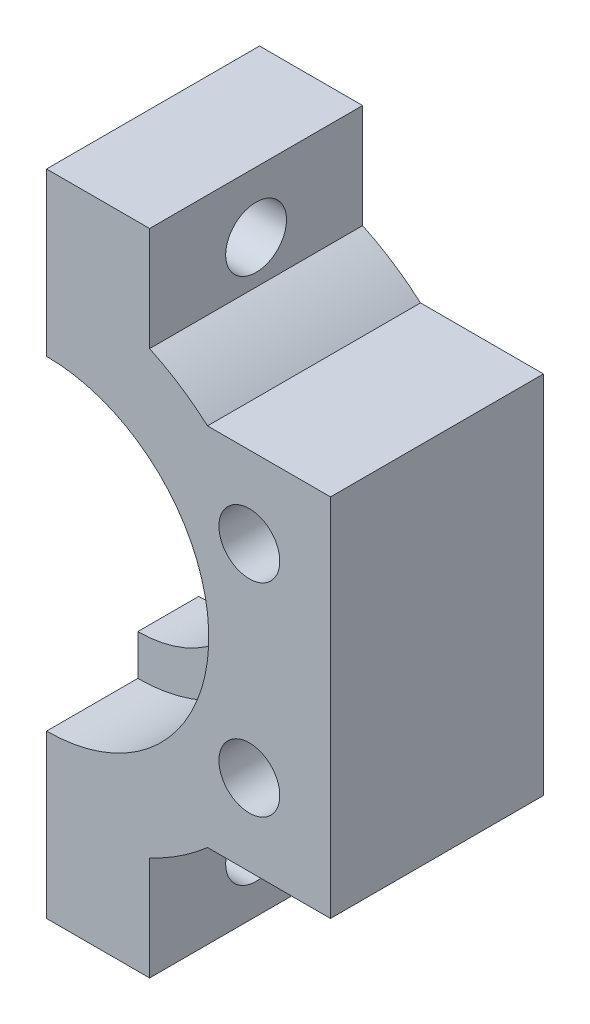
ISO-10303-21;
HEADER;
FILE_DESCRIPTION(('STEP AP214'),'2;1');
FILE_NAME('part.step','',(''),(''),'','','');
FILE_SCHEMA(('AUTOMOTIVE_DESIGN { 1 0 10303 214 1 1 1 1 }'));
ENDSEC;
DATA;
#1=APPLICATION_CONTEXT('core data for automotive mechanical design processes');
#2=APPLICATION_PROTOCOL_DEFINITION('international standard','automotive_design',2000,#1);
#3=PRODUCT_CONTEXT('',#1,'mechanical');
#4=PRODUCT('Part','Part','',(#3));
#5=PRODUCT_RELATED_PRODUCT_CATEGORY('part','',(#4));
#6=PRODUCT_DEFINITION_FORMATION('','',#4);
#7=PRODUCT_DEFINITION_CONTEXT('part definition',#1,'design');
#8=PRODUCT_DEFINITION('design','',#6,#7);
#9=PRODUCT_DEFINITION_SHAPE('','',#8);
#10=(LENGTH_UNIT() NAMED_UNIT(*) SI_UNIT(.MILLI.,.METRE.));
#11=(NAMED_UNIT(*) PLANE_ANGLE_UNIT() SI_UNIT($,.RADIAN.));
#12=(NAMED_UNIT(*) SI_UNIT($,.STERADIAN.) SOLID_ANGLE_UNIT());
#13=UNCERTAINTY_MEASURE_WITH_UNIT(LENGTH_MEASURE(1.E-05),#10,'distance_accuracy_value','');
#14=(GEOMETRIC_REPRESENTATION_CONTEXT(3) GLOBAL_UNCERTAINTY_ASSIGNED_CONTEXT((#13)) GLOBAL_UNIT_ASSIGNED_CONTEXT((#10,
#11,#12)) REPRESENTATION_CONTEXT('',''));
#15=CARTESIAN_POINT('',(0.,0.,0.));
#16=DIRECTION('',(0.,0.,1.));
#17=DIRECTION('',(1.,0.,0.));
#18=AXIS2_PLACEMENT_3D('',#15,#16,#17);
#19=CARTESIAN_POINT('',(0.,0.,10.5));
#20=DIRECTION('',(0.,0.,-1.));
#21=DIRECTION('',(-1.,0.,0.));
#22=AXIS2_PLACEMENT_3D('',#19,#20,#21);
#23=CYLINDRICAL_SURFACE('',#22,6.);
#24=CARTESIAN_POINT('',(0.,0.,3.));
#25=DIRECTION('',(0.,0.,-1.));
#26=DIRECTION('',(-1.,0.,0.));
#27=AXIS2_PLACEMENT_3D('',#24,#25,#26);
#28=CIRCLE('',#27,6.);
#29=CARTESIAN_POINT('',(0.,-6.,3.));
#30=VERTEX_POINT('',#29);
#31=CARTESIAN_POINT('',(0.,6.,3.));
#32=VERTEX_POINT('',#31);
#33=EDGE_CURVE('E241',#30,#32,#28,.F.);
#34=ORIENTED_EDGE('',*,*,#33,.F.);
#35=DIRECTION('',(0.,0.,-1.));
#36=VECTOR('',#35,1.);
#37=CARTESIAN_POINT('',(0.,-6.,10.5));
#38=LINE('',#37,#36);
#39=CARTESIAN_POINT('',(0.,-6.,6.));
#40=VERTEX_POINT('',#39);
#41=EDGE_CURVE('E228',#40,#30,#38,.T.);
#42=ORIENTED_EDGE('',*,*,#41,.F.);
#43=CARTESIAN_POINT('',(0.,0.,6.));
#44=DIRECTION('',(0.,0.,1.));
#45=DIRECTION('',(1.,0.,0.));
#46=AXIS2_PLACEMENT_3D('',#43,#44,#45);
#47=CIRCLE('',#46,6.);
#48=CARTESIAN_POINT('',(0.,6.,6.));
#49=VERTEX_POINT('',#48);
#50=EDGE_CURVE('E58',#49,#40,#47,.F.);
#51=ORIENTED_EDGE('',*,*,#50,.F.);
#52=DIRECTION('',(0.,0.,-1.));
#53=VECTOR('',#52,1.);
#54=CARTESIAN_POINT('',(0.,6.,10.5));
#55=LINE('',#54,#53);
#56=EDGE_CURVE('E231',#49,#32,#55,.T.);
#57=ORIENTED_EDGE('',*,*,#56,.T.);
#58=EDGE_LOOP('',(#34,#42,#51,#57));
#59=FACE_BOUND('',#58,.T.);
#60=ADVANCED_FACE('F35',(#59),#23,.F.);
#61=CARTESIAN_POINT('',(0.,0.,10.5));
#62=DIRECTION('',(0.,0.,1.));
#63=DIRECTION('',(1.,0.,0.));
#64=AXIS2_PLACEMENT_3D('',#61,#62,#63);
#65=PLANE('',#64);
#66=CARTESIAN_POINT('',(0.,0.,10.5));
#67=DIRECTION('',(0.,0.,1.));
#68=DIRECTION('',(1.,0.,0.));
#69=AXIS2_PLACEMENT_3D('',#66,#67,#68);
#70=CIRCLE('',#69,8.);
#71=CARTESIAN_POINT('',(0.,-8.,10.5));
#72=VERTEX_POINT('',#71);
#73=CARTESIAN_POINT('',(0.,8.,10.5));
#74=VERTEX_POINT('',#73);
#75=EDGE_CURVE('E259',#72,#74,#70,.T.);
#76=ORIENTED_EDGE('',*,*,#75,.F.);
#77=DIRECTION('',(0.,-1.,0.));
#78=VECTOR('',#77,1.);
#79=CARTESIAN_POINT('',(0.,-6.,10.5));
#80=LINE('',#79,#78);
#81=CARTESIAN_POINT('',(0.,-16.,10.5));
#82=VERTEX_POINT('',#81);
#83=EDGE_CURVE('E281',#72,#82,#80,.T.);
#84=ORIENTED_EDGE('',*,*,#83,.T.);
#85=DIRECTION('',(1.,0.,0.));
#86=VECTOR('',#85,1.);
#87=CARTESIAN_POINT('',(5.08182667726296,-16.,10.5));
#88=LINE('',#87,#86);
#89=CARTESIAN_POINT('',(5.08182667726296,-16.,10.5));
#90=VERTEX_POINT('',#89);
#91=EDGE_CURVE('E283',#82,#90,#88,.T.);
#92=ORIENTED_EDGE('',*,*,#91,.T.);
#93=DIRECTION('',(0.,1.,0.));
#94=VECTOR('',#93,1.);
#95=CARTESIAN_POINT('',(5.08182667726297,-10.8708342652374,10.5));
#96=LINE('',#95,#94);
#97=CARTESIAN_POINT('',(5.08182667726297,-10.8708342652374,10.5));
#98=VERTEX_POINT('',#97);
#99=EDGE_CURVE('E285',#90,#98,#96,.T.);
#100=ORIENTED_EDGE('',*,*,#99,.T.);
#101=CARTESIAN_POINT('',(0.,0.,10.5));
#102=DIRECTION('',(0.,0.,1.));
#103=DIRECTION('',(1.,0.,0.));
#104=AXIS2_PLACEMENT_3D('',#101,#102,#103);
#105=CIRCLE('',#104,12.);
#106=CARTESIAN_POINT('',(7.93725393319378,-9.,10.5));
#107=VERTEX_POINT('',#106);
#108=EDGE_CURVE('E287',#98,#107,#105,.T.);
#109=ORIENTED_EDGE('',*,*,#108,.T.);
#110=DIRECTION('',(1.,0.,0.));
#111=VECTOR('',#110,1.);
#112=CARTESIAN_POINT('',(14.,-9.,10.5));
#113=LINE('',#112,#111);
#114=CARTESIAN_POINT('',(14.,-9.,10.5));
#115=VERTEX_POINT('',#114);
#116=EDGE_CURVE('E289',#107,#115,#113,.T.);
#117=ORIENTED_EDGE('',*,*,#116,.T.);
#118=DIRECTION('',(0.,1.,0.));
#119=VECTOR('',#118,1.);
#120=CARTESIAN_POINT('',(14.,9.,10.5));
#121=LINE('',#120,#119);
#122=CARTESIAN_POINT('',(14.,9.,10.5));
#123=VERTEX_POINT('',#122);
#124=EDGE_CURVE('E291',#115,#123,#121,.T.);
#125=ORIENTED_EDGE('',*,*,#124,.T.);
#126=DIRECTION('',(-1.,0.,0.));
#127=VECTOR('',#126,1.);
#128=CARTESIAN_POINT('',(7.93725393319378,9.,10.5));
#129=LINE('',#128,#127);
#130=CARTESIAN_POINT('',(7.93725393319378,9.,10.5));
#131=VERTEX_POINT('',#130);
#132=EDGE_CURVE('E293',#123,#131,#129,.T.);
#133=ORIENTED_EDGE('',*,*,#132,.T.);
#134=CARTESIAN_POINT('',(0.,0.,10.5));
#135=DIRECTION('',(0.,0.,1.));
#136=DIRECTION('',(1.,0.,0.));
#137=AXIS2_PLACEMENT_3D('',#134,#135,#136);
#138=CIRCLE('',#137,12.);
#139=CARTESIAN_POINT('',(5.08182667726297,10.8708342652373,10.5));
#140=VERTEX_POINT('',#139);
#141=EDGE_CURVE('E295',#131,#140,#138,.T.);
#142=ORIENTED_EDGE('',*,*,#141,.T.);
#143=DIRECTION('',(0.,1.,0.));
#144=VECTOR('',#143,1.);
#145=CARTESIAN_POINT('',(5.08182667726296,16.,10.5));
#146=LINE('',#145,#144);
#147=CARTESIAN_POINT('',(5.08182667726296,16.,10.5));
#148=VERTEX_POINT('',#147);
#149=EDGE_CURVE('E296',#140,#148,#146,.T.);
#150=ORIENTED_EDGE('',*,*,#149,.T.);
#151=DIRECTION('',(-1.,0.,0.));
#152=VECTOR('',#151,1.);
#153=CARTESIAN_POINT('',(0.,16.,10.5));
#154=LINE('',#153,#152);
#155=CARTESIAN_POINT('',(0.,16.,10.5));
#156=VERTEX_POINT('',#155);
#157=EDGE_CURVE('E179',#148,#156,#154,.T.);
#158=ORIENTED_EDGE('',*,*,#157,.T.);
#159=DIRECTION('',(0.,-1.,0.));
#160=VECTOR('',#159,1.);
#161=CARTESIAN_POINT('',(0.,9.,10.5));
#162=LINE('',#161,#160);
#163=EDGE_CURVE('E199',#156,#74,#162,.T.);
#164=ORIENTED_EDGE('',*,*,#163,.T.);
#165=EDGE_LOOP('',(#76,#84,#92,#100,#109,#117,#125,#133,#142,#150,#158,#164));
#166=FACE_BOUND('',#165,.T.);
#167=CARTESIAN_POINT('',(10.,5.,10.5));
#168=DIRECTION('',(0.,0.,1.));
#169=DIRECTION('',(1.,0.,0.));
#170=AXIS2_PLACEMENT_3D('',#167,#168,#169);
#171=CIRCLE('',#170,1.5);
#172=CARTESIAN_POINT('',(8.5,5.,10.5));
#173=VERTEX_POINT('',#172);
#174=EDGE_CURVE('E171',#173,#173,#171,.T.);
#175=ORIENTED_EDGE('',*,*,#174,.F.);
#176=EDGE_LOOP('',(#175));
#177=FACE_BOUND('',#176,.T.);
#178=CARTESIAN_POINT('',(10.,-5.,10.5));
#179=DIRECTION('',(0.,0.,1.));
#180=DIRECTION('',(1.,0.,0.));
#181=AXIS2_PLACEMENT_3D('',#178,#179,#180);
#182=CIRCLE('',#181,1.5);
#183=CARTESIAN_POINT('',(8.5,-5.,10.5));
#184=VERTEX_POINT('',#183);
#185=EDGE_CURVE('E272',#184,#184,#182,.T.);
#186=ORIENTED_EDGE('',*,*,#185,.F.);
#187=EDGE_LOOP('',(#186));
#188=FACE_BOUND('',#187,.T.);
#189=ADVANCED_FACE('F301',(#166,#177,#188),#65,.T.);
#190=CARTESIAN_POINT('',(0.,0.,0.));
#191=DIRECTION('',(0.,0.,1.));
#192=DIRECTION('',(1.,0.,0.));
#193=AXIS2_PLACEMENT_3D('',#190,#191,#192);
#194=PLANE('',#193);
#195=DIRECTION('',(0.,-1.,0.));
#196=VECTOR('',#195,1.);
#197=CARTESIAN_POINT('',(0.,-16.,0.));
#198=LINE('',#197,#196);
#199=CARTESIAN_POINT('',(0.,-8.,0.));
#200=VERTEX_POINT('',#199);
#201=CARTESIAN_POINT('',(0.,-16.,0.));
#202=VERTEX_POINT('',#201);
#203=EDGE_CURVE('E165',#200,#202,#198,.T.);
#204=ORIENTED_EDGE('',*,*,#203,.F.);
#205=CARTESIAN_POINT('',(0.,0.,0.));
#206=DIRECTION('',(0.,0.,-1.));
#207=DIRECTION('',(-1.,0.,0.));
#208=AXIS2_PLACEMENT_3D('',#205,#206,#207);
#209=CIRCLE('',#208,8.);
#210=CARTESIAN_POINT('',(0.,8.,0.));
#211=VERTEX_POINT('',#210);
#212=EDGE_CURVE('E150',#211,#200,#209,.T.);
#213=ORIENTED_EDGE('',*,*,#212,.F.);
#214=DIRECTION('',(0.,-1.,0.));
#215=VECTOR('',#214,1.);
#216=CARTESIAN_POINT('',(0.,9.,0.));
#217=LINE('',#216,#215);
#218=CARTESIAN_POINT('',(0.,16.,0.));
#219=VERTEX_POINT('',#218);
#220=EDGE_CURVE('E162',#219,#211,#217,.T.);
#221=ORIENTED_EDGE('',*,*,#220,.F.);
#222=DIRECTION('',(-1.,0.,0.));
#223=VECTOR('',#222,1.);
#224=CARTESIAN_POINT('',(0.,16.,0.));
#225=LINE('',#224,#223);
#226=CARTESIAN_POINT('',(5.08182667726296,16.,0.));
#227=VERTEX_POINT('',#226);
#228=EDGE_CURVE('E197',#227,#219,#225,.T.);
#229=ORIENTED_EDGE('',*,*,#228,.F.);
#230=DIRECTION('',(0.,1.,0.));
#231=VECTOR('',#230,1.);
#232=CARTESIAN_POINT('',(5.08182667726296,16.,0.));
#233=LINE('',#232,#231);
#234=CARTESIAN_POINT('',(5.08182667726297,10.8708342652373,0.));
#235=VERTEX_POINT('',#234);
#236=EDGE_CURVE('E195',#235,#227,#233,.T.);
#237=ORIENTED_EDGE('',*,*,#236,.F.);
#238=CARTESIAN_POINT('',(0.,0.,0.));
#239=DIRECTION('',(0.,0.,1.));
#240=DIRECTION('',(1.,0.,0.));
#241=AXIS2_PLACEMENT_3D('',#238,#239,#240);
#242=CIRCLE('',#241,12.);
#243=CARTESIAN_POINT('',(7.93725393319378,9.,0.));
#244=VERTEX_POINT('',#243);
#245=EDGE_CURVE('E193',#244,#235,#242,.T.);
#246=ORIENTED_EDGE('',*,*,#245,.F.);
#247=DIRECTION('',(-1.,0.,0.));
#248=VECTOR('',#247,1.);
#249=CARTESIAN_POINT('',(7.93725393319378,9.,0.));
#250=LINE('',#249,#248);
#251=CARTESIAN_POINT('',(14.,9.,0.));
#252=VERTEX_POINT('',#251);
#253=EDGE_CURVE('E191',#252,#244,#250,.T.);
#254=ORIENTED_EDGE('',*,*,#253,.F.);
#255=DIRECTION('',(0.,1.,0.));
#256=VECTOR('',#255,1.);
#257=CARTESIAN_POINT('',(14.,9.,0.));
#258=LINE('',#257,#256);
#259=CARTESIAN_POINT('',(14.,-9.,0.));
#260=VERTEX_POINT('',#259);
#261=EDGE_CURVE('E189',#260,#252,#258,.T.);
#262=ORIENTED_EDGE('',*,*,#261,.F.);
#263=DIRECTION('',(1.,0.,0.));
#264=VECTOR('',#263,1.);
#265=CARTESIAN_POINT('',(14.,-9.,0.));
#266=LINE('',#265,#264);
#267=CARTESIAN_POINT('',(7.93725393319378,-9.,0.));
#268=VERTEX_POINT('',#267);
#269=EDGE_CURVE('E187',#268,#260,#266,.T.);
#270=ORIENTED_EDGE('',*,*,#269,.F.);
#271=CARTESIAN_POINT('',(0.,0.,0.));
#272=DIRECTION('',(0.,0.,1.));
#273=DIRECTION('',(1.,0.,0.));
#274=AXIS2_PLACEMENT_3D('',#271,#272,#273);
#275=CIRCLE('',#274,12.);
#276=CARTESIAN_POINT('',(5.08182667726297,-10.8708342652374,0.));
#277=VERTEX_POINT('',#276);
#278=EDGE_CURVE('E185',#277,#268,#275,.T.);
#279=ORIENTED_EDGE('',*,*,#278,.F.);
#280=DIRECTION('',(0.,1.,0.));
#281=VECTOR('',#280,1.);
#282=CARTESIAN_POINT('',(5.08182667726297,-10.8708342652374,0.));
#283=LINE('',#282,#281);
#284=CARTESIAN_POINT('',(5.08182667726296,-16.,0.));
#285=VERTEX_POINT('',#284);
#286=EDGE_CURVE('E183',#285,#277,#283,.T.);
#287=ORIENTED_EDGE('',*,*,#286,.F.);
#288=DIRECTION('',(1.,0.,0.));
#289=VECTOR('',#288,1.);
#290=CARTESIAN_POINT('',(5.08182667726296,-16.,0.));
#291=LINE('',#290,#289);
#292=EDGE_CURVE('E173',#202,#285,#291,.T.);
#293=ORIENTED_EDGE('',*,*,#292,.F.);
#294=EDGE_LOOP('',(#204,#213,#221,#229,#237,#246,#254,#262,#270,#279,#287,#293));
#295=FACE_BOUND('',#294,.T.);
#296=CARTESIAN_POINT('',(10.,5.,0.));
#297=DIRECTION('',(0.,0.,1.));
#298=DIRECTION('',(1.,0.,0.));
#299=AXIS2_PLACEMENT_3D('',#296,#297,#298);
#300=CIRCLE('',#299,1.5);
#301=CARTESIAN_POINT('',(8.5,5.,0.));
#302=VERTEX_POINT('',#301);
#303=EDGE_CURVE('E176',#302,#302,#300,.T.);
#304=ORIENTED_EDGE('',*,*,#303,.T.);
#305=EDGE_LOOP('',(#304));
#306=FACE_BOUND('',#305,.T.);
#307=CARTESIAN_POINT('',(10.,-5.,0.));
#308=DIRECTION('',(0.,0.,1.));
#309=DIRECTION('',(1.,0.,0.));
#310=AXIS2_PLACEMENT_3D('',#307,#308,#309);
#311=CIRCLE('',#310,1.5);
#312=CARTESIAN_POINT('',(8.5,-5.,0.));
#313=VERTEX_POINT('',#312);
#314=EDGE_CURVE('E271',#313,#313,#311,.T.);
#315=ORIENTED_EDGE('',*,*,#314,.T.);
#316=EDGE_LOOP('',(#315));
#317=FACE_BOUND('',#316,.T.);
#318=ADVANCED_FACE('F159',(#295,#306,#317),#194,.F.);
#319=CARTESIAN_POINT('',(0.,9.,10.5));
#320=DIRECTION('',(1.,0.,0.));
#321=DIRECTION('',(0.,1.,0.));
#322=AXIS2_PLACEMENT_3D('',#319,#320,#321);
#323=PLANE('',#322);
#324=CARTESIAN_POINT('',(0.,13.,5.25));
#325=DIRECTION('',(1.,0.,0.));
#326=DIRECTION('',(0.,1.,0.));
#327=AXIS2_PLACEMENT_3D('',#324,#325,#326);
#328=CIRCLE('',#327,1.5);
#329=CARTESIAN_POINT('',(0.,14.5,5.25));
#330=VERTEX_POINT('',#329);
#331=EDGE_CURVE('E263',#330,#330,#328,.T.);
#332=ORIENTED_EDGE('',*,*,#331,.T.);
#333=EDGE_LOOP('',(#332));
#334=FACE_BOUND('',#333,.T.);
#335=ORIENTED_EDGE('',*,*,#220,.T.);
#336=DIRECTION('',(0.,0.,-1.));
#337=VECTOR('',#336,1.);
#338=CARTESIAN_POINT('',(0.,8.,3.));
#339=LINE('',#338,#337);
#340=CARTESIAN_POINT('',(0.,8.,3.));
#341=VERTEX_POINT('',#340);
#342=EDGE_CURVE('E147',#211,#341,#339,.F.);
#343=ORIENTED_EDGE('',*,*,#342,.T.);
#344=DIRECTION('',(0.,1.,0.));
#345=VECTOR('',#344,1.);
#346=CARTESIAN_POINT('',(0.,9.,3.));
#347=LINE('',#346,#345);
#348=EDGE_CURVE('E155',#32,#341,#347,.T.);
#349=ORIENTED_EDGE('',*,*,#348,.F.);
#350=ORIENTED_EDGE('',*,*,#56,.F.);
#351=DIRECTION('',(0.,-1.,0.));
#352=VECTOR('',#351,1.);
#353=CARTESIAN_POINT('',(0.,9.,6.));
#354=LINE('',#353,#352);
#355=CARTESIAN_POINT('',(0.,8.,6.));
#356=VERTEX_POINT('',#355);
#357=EDGE_CURVE('E261',#356,#49,#354,.T.);
#358=ORIENTED_EDGE('',*,*,#357,.F.);
#359=DIRECTION('',(0.,0.,1.));
#360=VECTOR('',#359,1.);
#361=CARTESIAN_POINT('',(0.,8.,6.));
#362=LINE('',#361,#360);
#363=EDGE_CURVE('E258',#356,#74,#362,.T.);
#364=ORIENTED_EDGE('',*,*,#363,.T.);
#365=ORIENTED_EDGE('',*,*,#163,.F.);
#366=DIRECTION('',(0.,0.,-1.));
#367=VECTOR('',#366,1.);
#368=CARTESIAN_POINT('',(0.,16.,10.5));
#369=LINE('',#368,#367);
#370=EDGE_CURVE('E170',#156,#219,#369,.T.);
#371=ORIENTED_EDGE('',*,*,#370,.T.);
#372=EDGE_LOOP('',(#335,#343,#349,#350,#358,#364,#365,#371));
#373=FACE_BOUND('',#372,.T.);
#374=ADVANCED_FACE('F37',(#334,#373),#323,.F.);
#375=CARTESIAN_POINT('',(0.,-16.,10.5));
#376=DIRECTION('',(1.,0.,0.));
#377=DIRECTION('',(0.,0.,-1.));
#378=AXIS2_PLACEMENT_3D('',#375,#376,#377);
#379=PLANE('',#378);
#380=CARTESIAN_POINT('',(0.,-13.,5.25));
#381=DIRECTION('',(1.,0.,0.));
#382=DIRECTION('',(0.,1.,0.));
#383=AXIS2_PLACEMENT_3D('',#380,#381,#382);
#384=CIRCLE('',#383,1.5);
#385=CARTESIAN_POINT('',(0.,-11.5,5.25));
#386=VERTEX_POINT('',#385);
#387=EDGE_CURVE('E307',#386,#386,#384,.T.);
#388=ORIENTED_EDGE('',*,*,#387,.T.);
#389=EDGE_LOOP('',(#388));
#390=FACE_BOUND('',#389,.T.);
#391=DIRECTION('',(0.,1.,0.));
#392=VECTOR('',#391,1.);
#393=CARTESIAN_POINT('',(0.,-16.,3.));
#394=LINE('',#393,#392);
#395=CARTESIAN_POINT('',(0.,-8.,3.));
#396=VERTEX_POINT('',#395);
#397=EDGE_CURVE('E43',#396,#30,#394,.T.);
#398=ORIENTED_EDGE('',*,*,#397,.F.);
#399=DIRECTION('',(0.,0.,-1.));
#400=VECTOR('',#399,1.);
#401=CARTESIAN_POINT('',(0.,-8.,3.));
#402=LINE('',#401,#400);
#403=EDGE_CURVE('E11',#396,#200,#402,.T.);
#404=ORIENTED_EDGE('',*,*,#403,.T.);
#405=ORIENTED_EDGE('',*,*,#203,.T.);
#406=DIRECTION('',(0.,0.,-1.));
#407=VECTOR('',#406,1.);
#408=CARTESIAN_POINT('',(0.,-16.,10.5));
#409=LINE('',#408,#407);
#410=EDGE_CURVE('E225',#82,#202,#409,.T.);
#411=ORIENTED_EDGE('',*,*,#410,.F.);
#412=ORIENTED_EDGE('',*,*,#83,.F.);
#413=DIRECTION('',(0.,0.,1.));
#414=VECTOR('',#413,1.);
#415=CARTESIAN_POINT('',(0.,-8.,6.));
#416=LINE('',#415,#414);
#417=CARTESIAN_POINT('',(0.,-8.,6.));
#418=VERTEX_POINT('',#417);
#419=EDGE_CURVE('E236',#72,#418,#416,.F.);
#420=ORIENTED_EDGE('',*,*,#419,.T.);
#421=DIRECTION('',(0.,-1.,0.));
#422=VECTOR('',#421,1.);
#423=CARTESIAN_POINT('',(0.,-16.,6.));
#424=LINE('',#423,#422);
#425=EDGE_CURVE('E234',#40,#418,#424,.T.);
#426=ORIENTED_EDGE('',*,*,#425,.F.);
#427=ORIENTED_EDGE('',*,*,#41,.T.);
#428=EDGE_LOOP('',(#398,#404,#405,#411,#412,#420,#426,#427));
#429=FACE_BOUND('',#428,.T.);
#430=ADVANCED_FACE('F247',(#390,#429),#379,.F.);
#431=CARTESIAN_POINT('',(5.08182667726296,-16.,10.5));
#432=DIRECTION('',(0.,1.,0.));
#433=DIRECTION('',(0.,0.,1.));
#434=AXIS2_PLACEMENT_3D('',#431,#432,#433);
#435=PLANE('',#434);
#436=ORIENTED_EDGE('',*,*,#292,.T.);
#437=DIRECTION('',(0.,0.,-1.));
#438=VECTOR('',#437,1.);
#439=CARTESIAN_POINT('',(5.08182667726296,-16.,10.5));
#440=LINE('',#439,#438);
#441=EDGE_CURVE('E222',#90,#285,#440,.T.);
#442=ORIENTED_EDGE('',*,*,#441,.F.);
#443=ORIENTED_EDGE('',*,*,#91,.F.);
#444=ORIENTED_EDGE('',*,*,#410,.T.);
#445=EDGE_LOOP('',(#436,#442,#443,#444));
#446=FACE_BOUND('',#445,.T.);
#447=ADVANCED_FACE('F356',(#446),#435,.F.);
#448=CARTESIAN_POINT('',(5.08182667726297,-10.8708342652374,10.5));
#449=DIRECTION('',(-1.,0.,0.));
#450=DIRECTION('',(0.,-1.,0.));
#451=AXIS2_PLACEMENT_3D('',#448,#449,#450);
#452=PLANE('',#451);
#453=CARTESIAN_POINT('',(5.081826677263,-13.,5.25));
#454=DIRECTION('',(1.,0.,0.));
#455=DIRECTION('',(0.,1.,0.));
#456=AXIS2_PLACEMENT_3D('',#453,#454,#455);
#457=CIRCLE('',#456,1.5);
#458=CARTESIAN_POINT('',(5.081826677263,-11.5,5.25));
#459=VERTEX_POINT('',#458);
#460=EDGE_CURVE('E154',#459,#459,#457,.T.);
#461=ORIENTED_EDGE('',*,*,#460,.F.);
#462=EDGE_LOOP('',(#461));
#463=FACE_BOUND('',#462,.T.);
#464=ORIENTED_EDGE('',*,*,#286,.T.);
#465=DIRECTION('',(0.,0.,-1.));
#466=VECTOR('',#465,1.);
#467=CARTESIAN_POINT('',(5.08182667726297,-10.8708342652374,10.5));
#468=LINE('',#467,#466);
#469=EDGE_CURVE('E219',#98,#277,#468,.T.);
#470=ORIENTED_EDGE('',*,*,#469,.F.);
#471=ORIENTED_EDGE('',*,*,#99,.F.);
#472=ORIENTED_EDGE('',*,*,#441,.T.);
#473=EDGE_LOOP('',(#464,#470,#471,#472));
#474=FACE_BOUND('',#473,.T.);
#475=ADVANCED_FACE('F353',(#463,#474),#452,.F.);
#476=CARTESIAN_POINT('',(0.,0.,10.5));
#477=DIRECTION('',(0.,0.,-1.));
#478=DIRECTION('',(-1.,0.,0.));
#479=AXIS2_PLACEMENT_3D('',#476,#477,#478);
#480=CYLINDRICAL_SURFACE('',#479,12.);
#481=ORIENTED_EDGE('',*,*,#278,.T.);
#482=DIRECTION('',(0.,0.,-1.));
#483=VECTOR('',#482,1.);
#484=CARTESIAN_POINT('',(7.93725393319378,-9.,10.5));
#485=LINE('',#484,#483);
#486=EDGE_CURVE('E216',#107,#268,#485,.T.);
#487=ORIENTED_EDGE('',*,*,#486,.F.);
#488=ORIENTED_EDGE('',*,*,#108,.F.);
#489=ORIENTED_EDGE('',*,*,#469,.T.);
#490=EDGE_LOOP('',(#481,#487,#488,#489));
#491=FACE_BOUND('',#490,.T.);
#492=ADVANCED_FACE('F349',(#491),#480,.T.);
#493=CARTESIAN_POINT('',(14.,-9.,10.5));
#494=DIRECTION('',(0.,1.,0.));
#495=DIRECTION('',(0.,0.,1.));
#496=AXIS2_PLACEMENT_3D('',#493,#494,#495);
#497=PLANE('',#496);
#498=ORIENTED_EDGE('',*,*,#269,.T.);
#499=DIRECTION('',(0.,0.,-1.));
#500=VECTOR('',#499,1.);
#501=CARTESIAN_POINT('',(14.,-9.,10.5));
#502=LINE('',#501,#500);
#503=EDGE_CURVE('E213',#115,#260,#502,.T.);
#504=ORIENTED_EDGE('',*,*,#503,.F.);
#505=ORIENTED_EDGE('',*,*,#116,.F.);
#506=ORIENTED_EDGE('',*,*,#486,.T.);
#507=EDGE_LOOP('',(#498,#504,#505,#506));
#508=FACE_BOUND('',#507,.T.);
#509=ADVANCED_FACE('F344',(#508),#497,.F.);
#510=CARTESIAN_POINT('',(14.,9.,10.5));
#511=DIRECTION('',(-1.,0.,0.));
#512=DIRECTION('',(0.,0.,1.));
#513=AXIS2_PLACEMENT_3D('',#510,#511,#512);
#514=PLANE('',#513);
#515=ORIENTED_EDGE('',*,*,#261,.T.);
#516=DIRECTION('',(0.,0.,-1.));
#517=VECTOR('',#516,1.);
#518=CARTESIAN_POINT('',(14.,9.,10.5));
#519=LINE('',#518,#517);
#520=EDGE_CURVE('E210',#123,#252,#519,.T.);
#521=ORIENTED_EDGE('',*,*,#520,.F.);
#522=ORIENTED_EDGE('',*,*,#124,.F.);
#523=ORIENTED_EDGE('',*,*,#503,.T.);
#524=EDGE_LOOP('',(#515,#521,#522,#523));
#525=FACE_BOUND('',#524,.T.);
#526=ADVANCED_FACE('F338',(#525),#514,.F.);
#527=CARTESIAN_POINT('',(7.93725393319378,9.,10.5));
#528=DIRECTION('',(0.,-1.,0.));
#529=DIRECTION('',(0.,0.,-1.));
#530=AXIS2_PLACEMENT_3D('',#527,#528,#529);
#531=PLANE('',#530);
#532=ORIENTED_EDGE('',*,*,#253,.T.);
#533=DIRECTION('',(0.,0.,-1.));
#534=VECTOR('',#533,1.);
#535=CARTESIAN_POINT('',(7.93725393319378,9.,10.5));
#536=LINE('',#535,#534);
#537=EDGE_CURVE('E207',#131,#244,#536,.T.);
#538=ORIENTED_EDGE('',*,*,#537,.F.);
#539=ORIENTED_EDGE('',*,*,#132,.F.);
#540=ORIENTED_EDGE('',*,*,#520,.T.);
#541=EDGE_LOOP('',(#532,#538,#539,#540));
#542=FACE_BOUND('',#541,.T.);
#543=ADVANCED_FACE('F334',(#542),#531,.F.);
#544=CARTESIAN_POINT('',(0.,0.,10.5));
#545=DIRECTION('',(0.,0.,-1.));
#546=DIRECTION('',(-1.,0.,0.));
#547=AXIS2_PLACEMENT_3D('',#544,#545,#546);
#548=CYLINDRICAL_SURFACE('',#547,12.);
#549=ORIENTED_EDGE('',*,*,#245,.T.);
#550=DIRECTION('',(0.,0.,-1.));
#551=VECTOR('',#550,1.);
#552=CARTESIAN_POINT('',(5.08182667726297,10.8708342652373,10.5));
#553=LINE('',#552,#551);
#554=EDGE_CURVE('E204',#140,#235,#553,.T.);
#555=ORIENTED_EDGE('',*,*,#554,.F.);
#556=ORIENTED_EDGE('',*,*,#141,.F.);
#557=ORIENTED_EDGE('',*,*,#537,.T.);
#558=EDGE_LOOP('',(#549,#555,#556,#557));
#559=FACE_BOUND('',#558,.T.);
#560=ADVANCED_FACE('F322',(#559),#548,.T.);
#561=CARTESIAN_POINT('',(5.08182667726296,16.,10.5));
#562=DIRECTION('',(-1.,0.,0.));
#563=DIRECTION('',(0.,-1.,0.));
#564=AXIS2_PLACEMENT_3D('',#561,#562,#563);
#565=PLANE('',#564);
#566=CARTESIAN_POINT('',(5.08182667726296,13.,5.25));
#567=DIRECTION('',(1.,0.,0.));
#568=DIRECTION('',(0.,1.,0.));
#569=AXIS2_PLACEMENT_3D('',#566,#567,#568);
#570=CIRCLE('',#569,1.5);
#571=CARTESIAN_POINT('',(5.08182667726296,14.5,5.25));
#572=VERTEX_POINT('',#571);
#573=EDGE_CURVE('E266',#572,#572,#570,.T.);
#574=ORIENTED_EDGE('',*,*,#573,.F.);
#575=EDGE_LOOP('',(#574));
#576=FACE_BOUND('',#575,.T.);
#577=ORIENTED_EDGE('',*,*,#236,.T.);
#578=DIRECTION('',(0.,0.,-1.));
#579=VECTOR('',#578,1.);
#580=CARTESIAN_POINT('',(5.08182667726296,16.,10.5));
#581=LINE('',#580,#579);
#582=EDGE_CURVE('E201',#148,#227,#581,.T.);
#583=ORIENTED_EDGE('',*,*,#582,.F.);
#584=ORIENTED_EDGE('',*,*,#149,.F.);
#585=ORIENTED_EDGE('',*,*,#554,.T.);
#586=EDGE_LOOP('',(#577,#583,#584,#585));
#587=FACE_BOUND('',#586,.T.);
#588=ADVANCED_FACE('F319',(#576,#587),#565,.F.);
#589=CARTESIAN_POINT('',(0.,16.,10.5));
#590=DIRECTION('',(0.,-1.,0.));
#591=DIRECTION('',(0.,0.,-1.));
#592=AXIS2_PLACEMENT_3D('',#589,#590,#591);
#593=PLANE('',#592);
#594=ORIENTED_EDGE('',*,*,#228,.T.);
#595=ORIENTED_EDGE('',*,*,#370,.F.);
#596=ORIENTED_EDGE('',*,*,#157,.F.);
#597=ORIENTED_EDGE('',*,*,#582,.T.);
#598=EDGE_LOOP('',(#594,#595,#596,#597));
#599=FACE_BOUND('',#598,.T.);
#600=ADVANCED_FACE('F304',(#599),#593,.F.);
#601=CARTESIAN_POINT('',(10.,5.,10.5));
#602=DIRECTION('',(0.,0.,-1.));
#603=DIRECTION('',(-1.,0.,0.));
#604=AXIS2_PLACEMENT_3D('',#601,#602,#603);
#605=CYLINDRICAL_SURFACE('',#604,1.5);
#606=CARTESIAN_POINT('',(8.5,5.,10.5));
#607=CARTESIAN_POINT('',(8.5,5.,10.390625));
#608=CARTESIAN_POINT('',(8.5,5.,10.28125));
#609=CARTESIAN_POINT('',(8.5,5.,10.0625));
#610=CARTESIAN_POINT('',(8.5,5.,9.953125));
#611=CARTESIAN_POINT('',(8.5,5.,9.734375));
#612=CARTESIAN_POINT('',(8.5,5.,9.625));
#613=CARTESIAN_POINT('',(8.5,5.,9.40625));
#614=CARTESIAN_POINT('',(8.5,5.,9.296875));
#615=CARTESIAN_POINT('',(8.5,5.,9.078125));
#616=CARTESIAN_POINT('',(8.5,5.,8.96875));
#617=CARTESIAN_POINT('',(8.5,5.,8.75));
#618=CARTESIAN_POINT('',(8.5,5.,8.640625));
#619=CARTESIAN_POINT('',(8.5,5.,8.421875));
#620=CARTESIAN_POINT('',(8.5,5.,8.3125));
#621=CARTESIAN_POINT('',(8.5,5.,8.09375));
#622=CARTESIAN_POINT('',(8.5,5.,7.984375));
#623=CARTESIAN_POINT('',(8.5,5.,7.765625));
#624=CARTESIAN_POINT('',(8.5,5.,7.65625));
#625=CARTESIAN_POINT('',(8.5,5.,7.4375));
#626=CARTESIAN_POINT('',(8.5,5.,7.328125));
#627=CARTESIAN_POINT('',(8.5,5.,7.109375));
#628=CARTESIAN_POINT('',(8.5,5.,7.));
#629=CARTESIAN_POINT('',(8.5,5.,6.78125));
#630=CARTESIAN_POINT('',(8.5,5.,6.671875));
#631=CARTESIAN_POINT('',(8.5,5.,6.453125));
#632=CARTESIAN_POINT('',(8.5,5.,6.34375));
#633=CARTESIAN_POINT('',(8.5,5.,6.125));
#634=CARTESIAN_POINT('',(8.5,5.,6.015625));
#635=CARTESIAN_POINT('',(8.5,5.,5.796875));
#636=CARTESIAN_POINT('',(8.5,5.,5.6875));
#637=CARTESIAN_POINT('',(8.5,5.,5.46875));
#638=CARTESIAN_POINT('',(8.5,5.,5.359375));
#639=CARTESIAN_POINT('',(8.5,5.,5.140625));
#640=CARTESIAN_POINT('',(8.5,5.,5.03125));
#641=CARTESIAN_POINT('',(8.5,5.,4.8125));
#642=CARTESIAN_POINT('',(8.5,5.,4.703125));
#643=CARTESIAN_POINT('',(8.5,5.,4.484375));
#644=CARTESIAN_POINT('',(8.5,5.,4.375));
#645=CARTESIAN_POINT('',(8.5,5.,4.15625));
#646=CARTESIAN_POINT('',(8.5,5.,4.046875));
#647=CARTESIAN_POINT('',(8.5,5.,3.828125));
#648=CARTESIAN_POINT('',(8.5,5.,3.71875));
#649=CARTESIAN_POINT('',(8.5,5.,3.5));
#650=CARTESIAN_POINT('',(8.5,5.,3.390625));
#651=CARTESIAN_POINT('',(8.5,5.,3.171875));
#652=CARTESIAN_POINT('',(8.5,5.,3.0625));
#653=CARTESIAN_POINT('',(8.5,5.,2.84375));
#654=CARTESIAN_POINT('',(8.5,5.,2.734375));
#655=CARTESIAN_POINT('',(8.5,5.,2.515625));
#656=CARTESIAN_POINT('',(8.5,5.,2.40625));
#657=CARTESIAN_POINT('',(8.5,5.,2.1875));
#658=CARTESIAN_POINT('',(8.5,5.,2.078125));
#659=CARTESIAN_POINT('',(8.5,5.,1.859375));
#660=CARTESIAN_POINT('',(8.5,5.,1.75));
#661=CARTESIAN_POINT('',(8.5,5.,1.53125));
#662=CARTESIAN_POINT('',(8.5,5.,1.421875));
#663=CARTESIAN_POINT('',(8.5,5.,1.203125));
#664=CARTESIAN_POINT('',(8.5,5.,1.09375));
#665=CARTESIAN_POINT('',(8.5,5.,0.875000000000001));
#666=CARTESIAN_POINT('',(8.5,5.,0.765625000000001));
#667=CARTESIAN_POINT('',(8.5,5.,0.546875));
#668=CARTESIAN_POINT('',(8.5,5.,0.4375));
#669=CARTESIAN_POINT('',(8.5,5.,0.21875));
#670=CARTESIAN_POINT('',(8.5,5.,0.109375));
#671=CARTESIAN_POINT('',(8.5,5.,0.));
#672=B_SPLINE_CURVE_WITH_KNOTS('',3,(#606,#607,#608,#609,#610,#611,#612,#613,#614,#615,#616,
#617,#618,#619,#620,#621,#622,#623,#624,#625,#626,#627,#628,#629,#630,#631,#632,#633,#634,#635,
#636,#637,#638,#639,#640,#641,#642,#643,#644,#645,#646,#647,#648,#649,#650,#651,#652,#653,#654,
#655,#656,#657,#658,#659,#660,#661,#662,#663,#664,#665,#666,#667,#668,#669,#670,#671),
.UNSPECIFIED.,.F.,.F.,(4,2,2,2,2,2,2,2,2,2,2,2,2,2,2,2,2,2,2,2,2,2,2,2,2,2,2,2,2,2,2,2,4),(0.,
0.328124999999999,0.656249999999999,0.984374999999999,1.3125,1.640625,1.96875,2.296875,2.625,
2.953125,3.28125,3.609375,3.9375,4.265625,4.59375,4.921875,5.25,5.578125,5.90625,6.234375,
6.5625,6.890625,7.21875,7.546875,7.875,8.203125,8.53125,8.859375,9.1875,9.515625,9.84375,
10.171875,10.5),.UNSPECIFIED.);
#673=EDGE_CURVE('BSEAM379',#173,#302,#672,.T.);
#674=ORIENTED_EDGE('',*,*,#174,.T.);
#675=ORIENTED_EDGE('',*,*,#303,.F.);
#676=ORIENTED_EDGE('',*,*,#673,.T.);
#677=ORIENTED_EDGE('',*,*,#673,.F.);
#678=EDGE_LOOP('',(#674,#676,#675,#677));
#679=FACE_BOUND('',#678,.T.);
#680=ADVANCED_FACE('F379',(#679),#605,.F.);
#681=CARTESIAN_POINT('',(10.,-5.,10.5));
#682=DIRECTION('',(0.,0.,-1.));
#683=DIRECTION('',(-1.,0.,0.));
#684=AXIS2_PLACEMENT_3D('',#681,#682,#683);
#685=CYLINDRICAL_SURFACE('',#684,1.5);
#686=CARTESIAN_POINT('',(8.5,-5.,10.5));
#687=CARTESIAN_POINT('',(8.5,-5.,10.390625));
#688=CARTESIAN_POINT('',(8.5,-5.,10.28125));
#689=CARTESIAN_POINT('',(8.5,-5.,10.0625));
#690=CARTESIAN_POINT('',(8.5,-5.,9.953125));
#691=CARTESIAN_POINT('',(8.5,-5.,9.734375));
#692=CARTESIAN_POINT('',(8.5,-5.,9.625));
#693=CARTESIAN_POINT('',(8.5,-5.,9.40625));
#694=CARTESIAN_POINT('',(8.5,-5.,9.296875));
#695=CARTESIAN_POINT('',(8.5,-5.,9.078125));
#696=CARTESIAN_POINT('',(8.5,-5.,8.96875));
#697=CARTESIAN_POINT('',(8.5,-5.,8.75));
#698=CARTESIAN_POINT('',(8.5,-5.,8.640625));
#699=CARTESIAN_POINT('',(8.5,-5.,8.421875));
#700=CARTESIAN_POINT('',(8.5,-5.,8.3125));
#701=CARTESIAN_POINT('',(8.5,-5.,8.09375));
#702=CARTESIAN_POINT('',(8.5,-5.,7.984375));
#703=CARTESIAN_POINT('',(8.5,-5.,7.765625));
#704=CARTESIAN_POINT('',(8.5,-5.,7.65625));
#705=CARTESIAN_POINT('',(8.5,-5.,7.4375));
#706=CARTESIAN_POINT('',(8.5,-5.,7.328125));
#707=CARTESIAN_POINT('',(8.5,-5.,7.109375));
#708=CARTESIAN_POINT('',(8.5,-5.,7.));
#709=CARTESIAN_POINT('',(8.5,-5.,6.78125));
#710=CARTESIAN_POINT('',(8.5,-5.,6.671875));
#711=CARTESIAN_POINT('',(8.5,-5.,6.453125));
#712=CARTESIAN_POINT('',(8.5,-5.,6.34375));
#713=CARTESIAN_POINT('',(8.5,-5.,6.125));
#714=CARTESIAN_POINT('',(8.5,-5.,6.015625));
#715=CARTESIAN_POINT('',(8.5,-5.,5.796875));
#716=CARTESIAN_POINT('',(8.5,-5.,5.6875));
#717=CARTESIAN_POINT('',(8.5,-5.,5.46875));
#718=CARTESIAN_POINT('',(8.5,-5.,5.359375));
#719=CARTESIAN_POINT('',(8.5,-5.,5.140625));
#720=CARTESIAN_POINT('',(8.5,-5.,5.03125));
#721=CARTESIAN_POINT('',(8.5,-5.,4.8125));
#722=CARTESIAN_POINT('',(8.5,-5.,4.703125));
#723=CARTESIAN_POINT('',(8.5,-5.,4.484375));
#724=CARTESIAN_POINT('',(8.5,-5.,4.375));
#725=CARTESIAN_POINT('',(8.5,-5.,4.15625));
#726=CARTESIAN_POINT('',(8.5,-5.,4.046875));
#727=CARTESIAN_POINT('',(8.5,-5.,3.828125));
#728=CARTESIAN_POINT('',(8.5,-5.,3.71875));
#729=CARTESIAN_POINT('',(8.5,-5.,3.5));
#730=CARTESIAN_POINT('',(8.5,-5.,3.390625));
#731=CARTESIAN_POINT('',(8.5,-5.,3.171875));
#732=CARTESIAN_POINT('',(8.5,-5.,3.0625));
#733=CARTESIAN_POINT('',(8.5,-5.,2.84375));
#734=CARTESIAN_POINT('',(8.5,-5.,2.734375));
#735=CARTESIAN_POINT('',(8.5,-5.,2.515625));
#736=CARTESIAN_POINT('',(8.5,-5.,2.40625));
#737=CARTESIAN_POINT('',(8.5,-5.,2.1875));
#738=CARTESIAN_POINT('',(8.5,-5.,2.078125));
#739=CARTESIAN_POINT('',(8.5,-5.,1.859375));
#740=CARTESIAN_POINT('',(8.5,-5.,1.75));
#741=CARTESIAN_POINT('',(8.5,-5.,1.53125));
#742=CARTESIAN_POINT('',(8.5,-5.,1.421875));
#743=CARTESIAN_POINT('',(8.5,-5.,1.203125));
#744=CARTESIAN_POINT('',(8.5,-5.,1.09375));
#745=CARTESIAN_POINT('',(8.5,-5.,0.875000000000001));
#746=CARTESIAN_POINT('',(8.5,-5.,0.765625000000001));
#747=CARTESIAN_POINT('',(8.5,-5.,0.546875));
#748=CARTESIAN_POINT('',(8.5,-5.,0.4375));
#749=CARTESIAN_POINT('',(8.5,-5.,0.21875));
#750=CARTESIAN_POINT('',(8.5,-5.,0.109375));
#751=CARTESIAN_POINT('',(8.5,-5.,0.));
#752=B_SPLINE_CURVE_WITH_KNOTS('',3,(#686,#687,#688,#689,#690,#691,#692,#693,#694,#695,#696,
#697,#698,#699,#700,#701,#702,#703,#704,#705,#706,#707,#708,#709,#710,#711,#712,#713,#714,#715,
#716,#717,#718,#719,#720,#721,#722,#723,#724,#725,#726,#727,#728,#729,#730,#731,#732,#733,#734,
#735,#736,#737,#738,#739,#740,#741,#742,#743,#744,#745,#746,#747,#748,#749,#750,#751),
.UNSPECIFIED.,.F.,.F.,(4,2,2,2,2,2,2,2,2,2,2,2,2,2,2,2,2,2,2,2,2,2,2,2,2,2,2,2,2,2,2,2,4),(0.,
0.328124999999999,0.656249999999999,0.984374999999999,1.3125,1.640625,1.96875,2.296875,2.625,
2.953125,3.28125,3.609375,3.9375,4.265625,4.59375,4.921875,5.25,5.578125,5.90625,6.234375,
6.5625,6.890625,7.21875,7.546875,7.875,8.203125,8.53125,8.859375,9.1875,9.515625,9.84375,
10.171875,10.5),.UNSPECIFIED.);
#753=EDGE_CURVE('BSEAM428',#184,#313,#752,.T.);
#754=ORIENTED_EDGE('',*,*,#185,.T.);
#755=ORIENTED_EDGE('',*,*,#314,.F.);
#756=ORIENTED_EDGE('',*,*,#753,.T.);
#757=ORIENTED_EDGE('',*,*,#753,.F.);
#758=EDGE_LOOP('',(#754,#756,#755,#757));
#759=FACE_BOUND('',#758,.T.);
#760=ADVANCED_FACE('F428',(#759),#685,.F.);
#761=CARTESIAN_POINT('',(0.,0.,6.));
#762=DIRECTION('',(0.,0.,1.));
#763=DIRECTION('',(1.,0.,0.));
#764=AXIS2_PLACEMENT_3D('',#761,#762,#763);
#765=CYLINDRICAL_SURFACE('',#764,8.);
#766=CARTESIAN_POINT('',(0.,0.,6.));
#767=DIRECTION('',(0.,0.,1.));
#768=DIRECTION('',(1.,0.,0.));
#769=AXIS2_PLACEMENT_3D('',#766,#767,#768);
#770=CIRCLE('',#769,8.);
#771=EDGE_CURVE('E252',#418,#356,#770,.T.);
#772=ORIENTED_EDGE('',*,*,#771,.F.);
#773=ORIENTED_EDGE('',*,*,#419,.F.);
#774=ORIENTED_EDGE('',*,*,#75,.T.);
#775=ORIENTED_EDGE('',*,*,#363,.F.);
#776=EDGE_LOOP('',(#772,#773,#774,#775));
#777=FACE_BOUND('',#776,.T.);
#778=ADVANCED_FACE('F255',(#777),#765,.F.);
#779=CARTESIAN_POINT('',(0.,0.,6.));
#780=DIRECTION('',(0.,0.,1.));
#781=DIRECTION('',(1.,0.,0.));
#782=AXIS2_PLACEMENT_3D('',#779,#780,#781);
#783=PLANE('',#782);
#784=ORIENTED_EDGE('',*,*,#357,.T.);
#785=ORIENTED_EDGE('',*,*,#50,.T.);
#786=ORIENTED_EDGE('',*,*,#425,.T.);
#787=ORIENTED_EDGE('',*,*,#771,.T.);
#788=EDGE_LOOP('',(#784,#785,#786,#787));
#789=FACE_BOUND('',#788,.T.);
#790=ADVANCED_FACE('F251',(#789),#783,.T.);
#791=CARTESIAN_POINT('',(0.,13.,5.25));
#792=DIRECTION('',(1.,0.,0.));
#793=DIRECTION('',(0.,1.,0.));
#794=AXIS2_PLACEMENT_3D('',#791,#792,#793);
#795=CYLINDRICAL_SURFACE('',#794,1.5);
#796=ORIENTED_EDGE('',*,*,#331,.F.);
#797=EDGE_LOOP('',(#796));
#798=FACE_BOUND('',#797,.T.);
#799=ORIENTED_EDGE('',*,*,#573,.T.);
#800=EDGE_LOOP('',(#799));
#801=FACE_BOUND('',#800,.T.);
#802=ADVANCED_FACE('F317',(#798,#801),#795,.F.);
#803=CARTESIAN_POINT('',(0.,-13.,5.25));
#804=DIRECTION('',(1.,0.,0.));
#805=DIRECTION('',(0.,1.,0.));
#806=AXIS2_PLACEMENT_3D('',#803,#804,#805);
#807=CYLINDRICAL_SURFACE('',#806,1.5);
#808=ORIENTED_EDGE('',*,*,#387,.F.);
#809=EDGE_LOOP('',(#808));
#810=FACE_BOUND('',#809,.T.);
#811=ORIENTED_EDGE('',*,*,#460,.T.);
#812=EDGE_LOOP('',(#811));
#813=FACE_BOUND('',#812,.T.);
#814=ADVANCED_FACE('F452',(#810,#813),#807,.F.);
#815=CARTESIAN_POINT('',(0.,0.,3.));
#816=DIRECTION('',(0.,0.,-1.));
#817=DIRECTION('',(-1.,0.,0.));
#818=AXIS2_PLACEMENT_3D('',#815,#816,#817);
#819=CYLINDRICAL_SURFACE('',#818,8.);
#820=ORIENTED_EDGE('',*,*,#212,.T.);
#821=ORIENTED_EDGE('',*,*,#403,.F.);
#822=CARTESIAN_POINT('',(0.,0.,3.));
#823=DIRECTION('',(0.,0.,-1.));
#824=DIRECTION('',(-1.,0.,0.));
#825=AXIS2_PLACEMENT_3D('',#822,#823,#824);
#826=CIRCLE('',#825,8.);
#827=EDGE_CURVE('E50',#341,#396,#826,.T.);
#828=ORIENTED_EDGE('',*,*,#827,.F.);
#829=ORIENTED_EDGE('',*,*,#342,.F.);
#830=EDGE_LOOP('',(#820,#821,#828,#829));
#831=FACE_BOUND('',#830,.T.);
#832=ADVANCED_FACE('F149',(#831),#819,.F.);
#833=CARTESIAN_POINT('',(0.,0.,3.));
#834=DIRECTION('',(0.,0.,-1.));
#835=DIRECTION('',(-1.,0.,0.));
#836=AXIS2_PLACEMENT_3D('',#833,#834,#835);
#837=PLANE('',#836);
#838=ORIENTED_EDGE('',*,*,#348,.T.);
#839=ORIENTED_EDGE('',*,*,#827,.T.);
#840=ORIENTED_EDGE('',*,*,#397,.T.);
#841=ORIENTED_EDGE('',*,*,#33,.T.);
#842=EDGE_LOOP('',(#838,#839,#840,#841));
#843=FACE_BOUND('',#842,.T.);
#844=ADVANCED_FACE('F240',(#843),#837,.T.);
#845=CLOSED_SHELL('',(#60,#189,#318,#374,#430,#447,#475,#492,#509,#526,#543,#560,#588,#600,#680,
#760,#778,#790,#802,#814,#832,#844));
#846=MANIFOLD_SOLID_BREP('B2',#845);
#847=ADVANCED_BREP_SHAPE_REPRESENTATION('',(#18,#846),#14);
#848=SHAPE_DEFINITION_REPRESENTATION(#9,#847);
ENDSEC;
END-ISO-10303-21;
